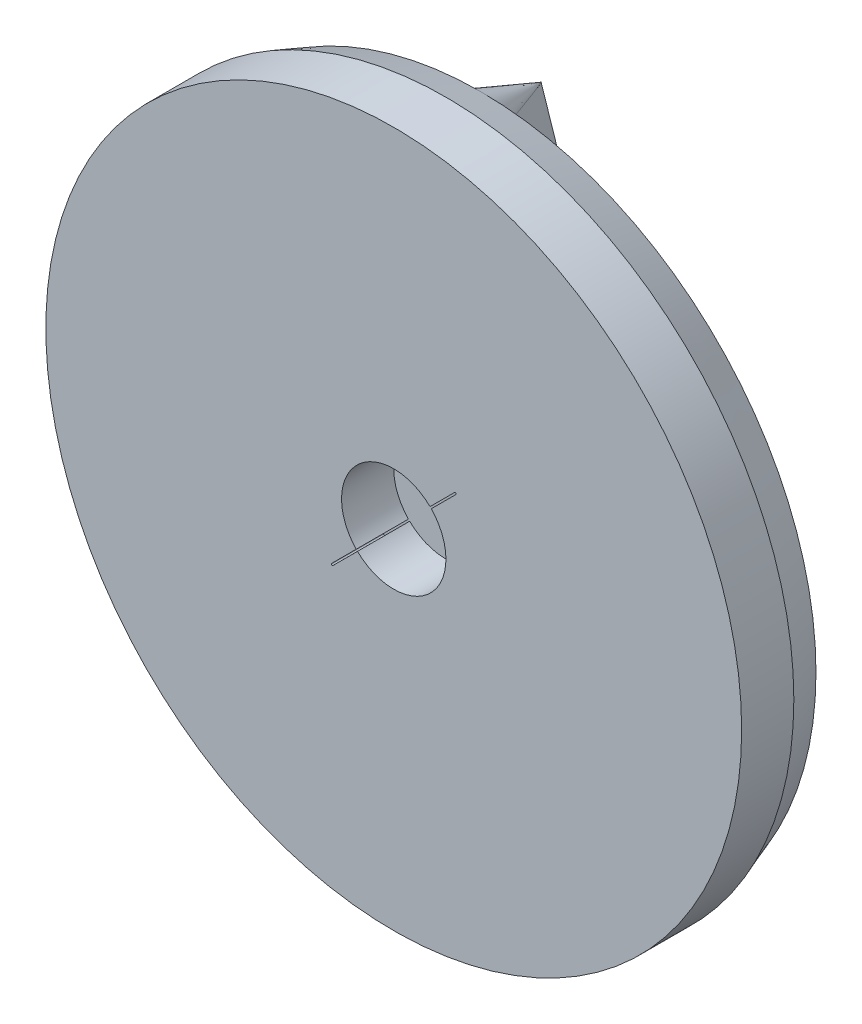
ISO-10303-21;
HEADER;
FILE_DESCRIPTION(('STEP AP214'),'2;1');
FILE_NAME('part.step','',(''),(''),'','','');
FILE_SCHEMA(('AUTOMOTIVE_DESIGN { 1 0 10303 214 1 1 1 1 }'));
ENDSEC;
DATA;
#1=APPLICATION_CONTEXT('core data for automotive mechanical design processes');
#2=APPLICATION_PROTOCOL_DEFINITION('international standard','automotive_design',2000,#1);
#3=PRODUCT_CONTEXT('',#1,'mechanical');
#4=PRODUCT('Part','Part','',(#3));
#5=PRODUCT_RELATED_PRODUCT_CATEGORY('part','',(#4));
#6=PRODUCT_DEFINITION_FORMATION('','',#4);
#7=PRODUCT_DEFINITION_CONTEXT('part definition',#1,'design');
#8=PRODUCT_DEFINITION('design','',#6,#7);
#9=PRODUCT_DEFINITION_SHAPE('','',#8);
#10=(LENGTH_UNIT() NAMED_UNIT(*) SI_UNIT(.MILLI.,.METRE.));
#11=(NAMED_UNIT(*) PLANE_ANGLE_UNIT() SI_UNIT($,.RADIAN.));
#12=(NAMED_UNIT(*) SI_UNIT($,.STERADIAN.) SOLID_ANGLE_UNIT());
#13=UNCERTAINTY_MEASURE_WITH_UNIT(LENGTH_MEASURE(1.E-05),#10,'distance_accuracy_value','');
#14=(GEOMETRIC_REPRESENTATION_CONTEXT(3) GLOBAL_UNCERTAINTY_ASSIGNED_CONTEXT((#13)) GLOBAL_UNIT_ASSIGNED_CONTEXT((#10,
#11,#12)) REPRESENTATION_CONTEXT('',''));
#15=CARTESIAN_POINT('',(0.,0.,0.));
#16=DIRECTION('',(0.,0.,1.));
#17=DIRECTION('',(1.,0.,0.));
#18=AXIS2_PLACEMENT_3D('',#15,#16,#17);
#19=CARTESIAN_POINT('',(0.,0.,-2.));
#20=DIRECTION('',(0.,0.,1.));
#21=DIRECTION('',(1.,0.,0.));
#22=AXIS2_PLACEMENT_3D('',#19,#20,#21);
#23=PLANE('',#22);
#24=CARTESIAN_POINT('',(0.,18.,-2.));
#25=DIRECTION('',(0.,0.,1.));
#26=DIRECTION('',(1.,0.,0.));
#27=AXIS2_PLACEMENT_3D('',#24,#25,#26);
#28=CIRCLE('',#27,1.2720595314676);
#29=CARTESIAN_POINT('',(0.,19.2720595314676,-2.));
#30=VERTEX_POINT('',#29);
#31=CARTESIAN_POINT('',(-1.27172190277635,17.9706937955885,-1.99999999997781));
#32=VERTEX_POINT('',#31);
#33=EDGE_CURVE('E303',#30,#32,#28,.T.);
#34=ORIENTED_EDGE('',*,*,#33,.T.);
#35=DIRECTION('',(-0.0905357460425185,-0.995893206467704,0.));
#36=VECTOR('',#35,1.);
#37=CARTESIAN_POINT('',(-2.88160640972484,0.261964219065894,-2.));
#38=LINE('',#37,#36);
#39=CARTESIAN_POINT('',(-4.27194173697115,-15.0317243806433,-1.99999999999996));
#40=VERTEX_POINT('',#39);
#41=EDGE_CURVE('E308',#32,#40,#38,.T.);
#42=ORIENTED_EDGE('',*,*,#41,.T.);
#43=CARTESIAN_POINT('',(0.,-15.,-2.));
#44=DIRECTION('',(0.,0.,1.));
#45=DIRECTION('',(1.,0.,0.));
#46=AXIS2_PLACEMENT_3D('',#43,#44,#45);
#47=CIRCLE('',#46,4.2720595314676);
#48=CARTESIAN_POINT('',(0.,-19.2720595314676,-2.));
#49=VERTEX_POINT('',#48);
#50=EDGE_CURVE('E315',#40,#49,#47,.T.);
#51=ORIENTED_EDGE('',*,*,#50,.T.);
#52=CARTESIAN_POINT('',(0.,0.,-2.));
#53=DIRECTION('',(0.,0.,1.));
#54=DIRECTION('',(1.,0.,0.));
#55=AXIS2_PLACEMENT_3D('',#52,#53,#54);
#56=CIRCLE('',#55,19.2720595314676);
#57=EDGE_CURVE('E11',#30,#49,#56,.T.);
#58=ORIENTED_EDGE('',*,*,#57,.F.);
#59=EDGE_LOOP('',(#34,#42,#51,#58));
#60=FACE_BOUND('',#59,.T.);
#61=ADVANCED_FACE('F41',(#60),#23,.F.);
#62=CARTESIAN_POINT('',(0.,0.,0.));
#63=DIRECTION('',(0.,0.,1.));
#64=DIRECTION('',(1.,0.,0.));
#65=AXIS2_PLACEMENT_3D('',#62,#63,#64);
#66=CONICAL_SURFACE('',#65,20.,0.349065850398867);
#67=CARTESIAN_POINT('',(0.,0.,0.));
#68=DIRECTION('',(0.,0.,1.));
#69=DIRECTION('',(1.,0.,0.));
#70=AXIS2_PLACEMENT_3D('',#67,#68,#69);
#71=CIRCLE('',#70,20.);
#72=CARTESIAN_POINT('',(20.,0.,0.));
#73=VERTEX_POINT('',#72);
#74=EDGE_CURVE('E316',#73,#73,#71,.T.);
#75=ORIENTED_EDGE('',*,*,#74,.F.);
#76=EDGE_LOOP('',(#75));
#77=FACE_BOUND('',#76,.T.);
#78=ORIENTED_EDGE('',*,*,#57,.T.);
#79=EDGE_CURVE('E50',#49,#30,#56,.T.);
#80=ORIENTED_EDGE('',*,*,#79,.T.);
#81=EDGE_LOOP('',(#78,#80));
#82=FACE_BOUND('',#81,.T.);
#83=ADVANCED_FACE('F43',(#77,#82),#66,.T.);
#84=ORIENTED_EDGE('',*,*,#79,.F.);
#85=CARTESIAN_POINT('',(4.27194173697115,-15.0317243806433,-1.99999999999996));
#86=VERTEX_POINT('',#85);
#87=EDGE_CURVE('E312',#49,#86,#47,.T.);
#88=ORIENTED_EDGE('',*,*,#87,.T.);
#89=DIRECTION('',(-0.0905357460425186,0.995893206467704,0.));
#90=VECTOR('',#89,1.);
#91=CARTESIAN_POINT('',(2.88160640972484,0.261964219065895,-2.));
#92=LINE('',#91,#90);
#93=CARTESIAN_POINT('',(1.27172190276827,17.9706937955882,-2.));
#94=VERTEX_POINT('',#93);
#95=EDGE_CURVE('E247',#86,#94,#92,.T.);
#96=ORIENTED_EDGE('',*,*,#95,.T.);
#97=EDGE_CURVE('E307',#94,#30,#28,.T.);
#98=ORIENTED_EDGE('',*,*,#97,.T.);
#99=EDGE_LOOP('',(#84,#88,#96,#98));
#100=FACE_BOUND('',#99,.T.);
#101=ADVANCED_FACE('F262',(#100),#23,.F.);
#102=CARTESIAN_POINT('',(0.,-15.,0.));
#103=DIRECTION('',(0.,0.,1.));
#104=DIRECTION('',(1.,0.,0.));
#105=AXIS2_PLACEMENT_3D('',#102,#103,#104);
#106=CONICAL_SURFACE('',#105,5.,0.349065850398867);
#107=ORIENTED_EDGE('',*,*,#50,.F.);
#108=CARTESIAN_POINT('',(-1.35557940364719,-15.1131998099234,-10.));
#109=CARTESIAN_POINT('',(-1.47152429195794,-15.1127493254877,-9.68264022531766));
#110=CARTESIAN_POINT('',(-1.58742127746624,-15.1117086108638,-9.36526470524089));
#111=CARTESIAN_POINT('',(-1.81913886773945,-15.1087008475732,-8.73049223674115));
#112=CARTESIAN_POINT('',(-1.93495947296489,-15.1067338045439,-8.41309528846034));
#113=CARTESIAN_POINT('',(-2.2968381613521,-15.0995359334336,-7.4211345236218));
#114=CARTESIAN_POINT('',(-2.542798579936,-15.0931231478979,-6.74654393039555));
#115=CARTESIAN_POINT('',(-3.03455885754886,-15.0783757588888,-5.39732402360426));
#116=CARTESIAN_POINT('',(-3.28035871608836,-15.0700411495836,-4.72269470992793));
#117=CARTESIAN_POINT('',(-3.77184967112229,-15.0520090879505,-3.3733946763651));
#118=CARTESIAN_POINT('',(-4.01754076456712,-15.0423115995711,-2.69872395585534));
#119=CARTESIAN_POINT('',(-4.50883183261875,-15.0218658897777,-1.34937046916008));
#120=CARTESIAN_POINT('',(-4.75443180784455,-15.0111176756379,-0.674687703090297));
#121=CARTESIAN_POINT('',(-5.00000000000206,-15.0000000000249,-5.68905754800977E-13));
#122=B_SPLINE_CURVE_WITH_KNOTS('',3,(#108,#109,#110,#111,#112,#113,#114,#115,#116,#117,#118,
#119,#120,#121),.UNSPECIFIED.,.F.,.F.,(4,2,2,2,2,2,4),(0.,1.01362824345405,2.02725031829099,
4.18142558107841,6.33560738066218,8.48984617418498,10.6440700548492),.UNSPECIFIED.);
#123=CARTESIAN_POINT('',(-1.35557940364719,-15.1131998099234,-10.));
#124=VERTEX_POINT('',#123);
#125=EDGE_CURVE('E237',#124,#40,#122,.T.);
#126=ORIENTED_EDGE('',*,*,#125,.F.);
#127=CARTESIAN_POINT('',(0.,-15.,-10.));
#128=DIRECTION('',(0.,0.,1.));
#129=DIRECTION('',(1.,0.,0.));
#130=AXIS2_PLACEMENT_3D('',#127,#128,#129);
#131=CIRCLE('',#130,1.36029765733797);
#132=CARTESIAN_POINT('',(1.35557940364719,-15.1131998099234,-10.));
#133=VERTEX_POINT('',#132);
#134=EDGE_CURVE('E151',#124,#133,#131,.T.);
#135=ORIENTED_EDGE('',*,*,#134,.T.);
#136=CARTESIAN_POINT('',(1.35557940364719,-15.1131998099234,-10.));
#137=CARTESIAN_POINT('',(1.47152429195794,-15.1127493254877,-9.68264022531766));
#138=CARTESIAN_POINT('',(1.58742127746625,-15.1117086108638,-9.36526470524089));
#139=CARTESIAN_POINT('',(1.81913886773946,-15.1087008475732,-8.73049223674115));
#140=CARTESIAN_POINT('',(1.93495947296489,-15.1067338045439,-8.41309528846034));
#141=CARTESIAN_POINT('',(2.29683816135211,-15.0995359334336,-7.4211345236218));
#142=CARTESIAN_POINT('',(2.542798579936,-15.0931231478979,-6.74654393039555));
#143=CARTESIAN_POINT('',(3.03455885754887,-15.0783757588888,-5.39732402360427));
#144=CARTESIAN_POINT('',(3.28035871608836,-15.0700411495836,-4.72269470992793));
#145=CARTESIAN_POINT('',(3.7718496711223,-15.0520090879505,-3.3733946763651));
#146=CARTESIAN_POINT('',(4.01754076456712,-15.0423115995711,-2.69872395585534));
#147=CARTESIAN_POINT('',(4.50883183261875,-15.0218658897777,-1.34937046916008));
#148=CARTESIAN_POINT('',(4.75443180784456,-15.0111176756379,-0.6746877030903));
#149=CARTESIAN_POINT('',(5.00000000000206,-15.0000000000249,-5.70215291144058E-13));
#150=B_SPLINE_CURVE_WITH_KNOTS('',3,(#136,#137,#138,#139,#140,#141,#142,#143,#144,#145,#146,
#147,#148,#149),.UNSPECIFIED.,.F.,.F.,(4,2,2,2,2,2,4),(0.,1.01362824345405,2.02725031829099,
4.18142558107841,6.33560738066218,8.48984617418498,10.6440700548492),.UNSPECIFIED.);
#151=EDGE_CURVE('E249',#133,#86,#150,.T.);
#152=ORIENTED_EDGE('',*,*,#151,.T.);
#153=ORIENTED_EDGE('',*,*,#87,.F.);
#154=EDGE_LOOP('',(#107,#126,#135,#152,#153));
#155=FACE_BOUND('',#154,.T.);
#156=ADVANCED_FACE('F259',(#155),#106,.T.);
#157=CARTESIAN_POINT('',(-5.,-15.,0.));
#158=DIRECTION('',(-0.935833497208518,0.0850757724735016,-0.342020143325669));
#159=DIRECTION('',(-0.343264654725118,0.,0.939238721953288));
#160=AXIS2_PLACEMENT_3D('',#157,#158,#159);
#161=PLANE('',#160);
#162=ORIENTED_EDGE('',*,*,#41,.F.);
#163=CARTESIAN_POINT('',(0.,17.9924683009297,-5.47426166578347));
#164=CARTESIAN_POINT('',(-0.000658792508696172,17.9918721301336,-5.4726073760658));
#165=CARTESIAN_POINT('',(-0.00131899163214776,17.9913406864215,-5.47093313704391));
#166=CARTESIAN_POINT('',(-0.00263962265345564,17.990369181912,-5.46756129104861));
#167=CARTESIAN_POINT('',(-0.00330005258229472,17.9899289798807,-5.46586372459401));
#168=CARTESIAN_POINT('',(-0.00660119120331832,17.9878573956222,-5.45734646464226));
#169=CARTESIAN_POINT('',(-0.00923977768205241,17.9866136247982,-5.45043616156633));
#170=CARTESIAN_POINT('',(-0.0145127936017149,17.9844201137202,-5.4365537912668));
#171=CARTESIAN_POINT('',(-0.0171471898100953,17.9834712208195,-5.42958160419907));
#172=CARTESIAN_POINT('',(-0.0250221998469685,17.9808932100017,-5.40867531531193));
#173=CARTESIAN_POINT('',(-0.0302525776186212,17.9795245433101,-5.3947044354121));
#174=CARTESIAN_POINT('',(-0.0406972144000417,17.9770995793523,-5.36672907936651));
#175=CARTESIAN_POINT('',(-0.0459114679466594,17.9760433784645,-5.35272459419534));
#176=CARTESIAN_POINT('',(-0.0615432767863536,17.9731694920844,-5.31066779575507));
#177=CARTESIAN_POINT('',(-0.0719437063987493,17.9716481186552,-5.28258863555256));
#178=CARTESIAN_POINT('',(-0.103079585425852,17.9676533722367,-5.1983885000249));
#179=CARTESIAN_POINT('',(-0.123777495013433,17.9657438016001,-5.14222999798324));
#180=CARTESIAN_POINT('',(-0.165116283694516,17.9626022427273,-5.02990049522257));
#181=CARTESIAN_POINT('',(-0.185757182022399,17.9613699881948,-4.97372950811442));
#182=CARTESIAN_POINT('',(-0.247666378160753,17.958286597704,-4.80510090880773));
#183=CARTESIAN_POINT('',(-0.288888753669274,17.9570517306312,-4.69261565518737));
#184=CARTESIAN_POINT('',(-0.412431132476277,17.9545078686936,-4.35521250030029));
#185=CARTESIAN_POINT('',(-0.49466013336963,17.954357657174,-4.13025535780924));
#186=CARTESIAN_POINT('',(-0.659003830598069,17.9554293534376,-3.68031252458136));
#187=CARTESIAN_POINT('',(-0.741118530067599,17.9566512228219,-3.45532683481965));
#188=CARTESIAN_POINT('',(-0.987318725156767,17.9615534475133,-2.78045591086828));
#189=CARTESIAN_POINT('',(-1.15130204729044,17.9664704115592,-2.33054264302856));
#190=CARTESIAN_POINT('',(-1.42939349733308,17.9761667756041,-1.56721853772901));
#191=CARTESIAN_POINT('',(-1.5435365156784,17.9805351651275,-1.25381447003018));
#192=CARTESIAN_POINT('',(-1.77179223247623,17.989866742006,-0.626941342806422));
#193=CARTESIAN_POINT('',(-1.88590492200445,17.9948300343497,-0.313472281584696));
#194=CARTESIAN_POINT('',(-2.,18.,0.));
#195=B_SPLINE_CURVE_WITH_KNOTS('',3,(#163,#164,#165,#166,#167,#168,#169,#170,#171,#172,#173,
#174,#175,#176,#177,#178,#179,#180,#181,#182,#183,#184,#185,#186,#187,#188,#189,#190,#191,#192,
#193,#194),.UNSPECIFIED.,.F.,.F.,(4,2,2,2,2,2,2,2,2,2,2,2,2,2,2,4),(0.,0.00562865848783333,
0.0112485381626291,0.0337254741632951,0.056266414466628,0.101195369903801,0.146138169027114,
0.236076807309796,0.415713944813965,0.595280404839262,0.954694769083883,1.67322992369596,
2.39174496990232,3.82841037446911,4.82912426406011,5.83001502069884),.UNSPECIFIED.);
#196=CARTESIAN_POINT('',(0.,17.9924683009297,-5.47426166578347));
#197=VERTEX_POINT('',#196);
#198=EDGE_CURVE('E248',#197,#32,#195,.T.);
#199=ORIENTED_EDGE('',*,*,#198,.F.);
#200=DIRECTION('',(0.,0.970428403441208,0.241389133546952));
#201=VECTOR('',#200,1.);
#202=CARTESIAN_POINT('',(0.,19.2819117034801,-5.15351917247256));
#203=LINE('',#202,#201);
#204=CARTESIAN_POINT('',(0.,-0.201826369804339,-10.));
#205=VERTEX_POINT('',#204);
#206=EDGE_CURVE('E281',#205,#197,#203,.T.);
#207=ORIENTED_EDGE('',*,*,#206,.F.);
#208=DIRECTION('',(-0.0905357460425185,-0.995893206467704,0.));
#209=VECTOR('',#208,1.);
#210=CARTESIAN_POINT('',(-1.33426155682092,-14.8787034948345,-10.));
#211=LINE('',#210,#209);
#212=EDGE_CURVE('E293',#205,#124,#211,.T.);
#213=ORIENTED_EDGE('',*,*,#212,.T.);
#214=ORIENTED_EDGE('',*,*,#125,.T.);
#215=EDGE_LOOP('',(#162,#199,#207,#213,#214));
#216=FACE_BOUND('',#215,.T.);
#217=ADVANCED_FACE('F256',(#216),#161,.T.);
#218=CARTESIAN_POINT('',(0.,18.,0.));
#219=DIRECTION('',(0.,0.,1.));
#220=DIRECTION('',(1.,0.,0.));
#221=AXIS2_PLACEMENT_3D('',#218,#219,#220);
#222=CONICAL_SURFACE('',#221,2.,0.349065850398867);
#223=CARTESIAN_POINT('',(0.,18.,-5.49495483890924));
#224=VERTEX_POINT('',#223);
#225=VERTEX_LOOP('',#224);
#226=FACE_BOUND('',#225,.T.);
#227=ORIENTED_EDGE('',*,*,#97,.F.);
#228=CARTESIAN_POINT('',(0.,17.9924683009297,-5.47426166578347));
#229=CARTESIAN_POINT('',(0.000658792508696435,17.9918721301336,-5.4726073760658));
#230=CARTESIAN_POINT('',(0.00131899163214815,17.9913406864215,-5.47093313704391));
#231=CARTESIAN_POINT('',(0.00263962265345574,17.990369181912,-5.46756129104861));
#232=CARTESIAN_POINT('',(0.0033000525822944,17.9899289798807,-5.46586372459401));
#233=CARTESIAN_POINT('',(0.00660119120331671,17.9878573956222,-5.45734646464226));
#234=CARTESIAN_POINT('',(0.00923977768205238,17.9866136247982,-5.45043616156633));
#235=CARTESIAN_POINT('',(0.0145127936017156,17.9844201137202,-5.4365537912668));
#236=CARTESIAN_POINT('',(0.0171471898100951,17.9834712208195,-5.42958160419907));
#237=CARTESIAN_POINT('',(0.0250221998469676,17.9808932100017,-5.40867531531193));
#238=CARTESIAN_POINT('',(0.0302525776186212,17.9795245433101,-5.3947044354121));
#239=CARTESIAN_POINT('',(0.0406972144000423,17.9770995793523,-5.36672907936651));
#240=CARTESIAN_POINT('',(0.0459114679466596,17.9760433784645,-5.35272459419534));
#241=CARTESIAN_POINT('',(0.0615432767863528,17.9731694920844,-5.31066779575507));
#242=CARTESIAN_POINT('',(0.0719437063987487,17.9716481186552,-5.28258863555256));
#243=CARTESIAN_POINT('',(0.103079585425852,17.9676533722367,-5.19838850002491));
#244=CARTESIAN_POINT('',(0.123777495013432,17.9657438016001,-5.14222999798324));
#245=CARTESIAN_POINT('',(0.165116283694515,17.9626022427273,-5.02990049522257));
#246=CARTESIAN_POINT('',(0.185757182022398,17.9613699881948,-4.97372950811442));
#247=CARTESIAN_POINT('',(0.247666378160752,17.958286597704,-4.80510090880773));
#248=CARTESIAN_POINT('',(0.288888753669273,17.9570517306312,-4.69261565518737));
#249=CARTESIAN_POINT('',(0.412431132476277,17.9545078686936,-4.35521250030029));
#250=CARTESIAN_POINT('',(0.49466013336963,17.954357657174,-4.13025535780924));
#251=CARTESIAN_POINT('',(0.659003830598069,17.9554293534376,-3.68031252458137));
#252=CARTESIAN_POINT('',(0.741118530067599,17.9566512228219,-3.45532683481965));
#253=CARTESIAN_POINT('',(0.987318725156767,17.9615534475133,-2.78045591086828));
#254=CARTESIAN_POINT('',(1.15130204729044,17.9664704115592,-2.33054264302856));
#255=CARTESIAN_POINT('',(1.42939349733308,17.9761667756041,-1.56721853772901));
#256=CARTESIAN_POINT('',(1.54353651567839,17.9805351651275,-1.25381447003018));
#257=CARTESIAN_POINT('',(1.77179223247623,17.989866742006,-0.626941342806422));
#258=CARTESIAN_POINT('',(1.88590492200445,17.9948300343497,-0.313472281584695));
#259=CARTESIAN_POINT('',(2.,18.,0.));
#260=B_SPLINE_CURVE_WITH_KNOTS('',3,(#228,#229,#230,#231,#232,#233,#234,#235,#236,#237,#238,
#239,#240,#241,#242,#243,#244,#245,#246,#247,#248,#249,#250,#251,#252,#253,#254,#255,#256,#257,
#258,#259),.UNSPECIFIED.,.F.,.F.,(4,2,2,2,2,2,2,2,2,2,2,2,2,2,2,4),(0.,0.00562865848783287,
0.0112485381626292,0.0337254741632972,0.0562664144666271,0.101195369903802,0.146138169027116,
0.236076807309795,0.415713944813962,0.595280404839262,0.954694769083882,1.67322992369596,
2.39174496990231,3.82841037446911,4.82912426406011,5.83001502069884),.UNSPECIFIED.);
#261=EDGE_CURVE('E65',#197,#94,#260,.T.);
#262=ORIENTED_EDGE('',*,*,#261,.F.);
#263=ORIENTED_EDGE('',*,*,#198,.T.);
#264=ORIENTED_EDGE('',*,*,#33,.F.);
#265=EDGE_LOOP('',(#227,#262,#263,#264));
#266=FACE_BOUND('',#265,.T.);
#267=ADVANCED_FACE('F270',(#226,#266),#222,.T.);
#268=CARTESIAN_POINT('',(2.,18.,0.));
#269=DIRECTION('',(0.935833497208518,0.0850757724735017,-0.342020143325669));
#270=DIRECTION('',(-0.343264654725118,0.,-0.939238721953288));
#271=AXIS2_PLACEMENT_3D('',#268,#269,#270);
#272=PLANE('',#271);
#273=ORIENTED_EDGE('',*,*,#95,.F.);
#274=ORIENTED_EDGE('',*,*,#151,.F.);
#275=DIRECTION('',(-0.0905357460425186,0.995893206467704,0.));
#276=VECTOR('',#275,1.);
#277=CARTESIAN_POINT('',(1.33426155682092,-14.8787034948345,-10.));
#278=LINE('',#277,#276);
#279=EDGE_CURVE('E292',#133,#205,#278,.T.);
#280=ORIENTED_EDGE('',*,*,#279,.T.);
#281=ORIENTED_EDGE('',*,*,#206,.T.);
#282=ORIENTED_EDGE('',*,*,#261,.T.);
#283=EDGE_LOOP('',(#273,#274,#280,#281,#282));
#284=FACE_BOUND('',#283,.T.);
#285=ADVANCED_FACE('F264',(#284),#272,.T.);
#286=CARTESIAN_POINT('',(0.,-15.,-10.));
#287=DIRECTION('',(0.,0.,1.));
#288=DIRECTION('',(1.,0.,0.));
#289=AXIS2_PLACEMENT_3D('',#286,#287,#288);
#290=PLANE('',#289);
#291=ORIENTED_EDGE('',*,*,#134,.F.);
#292=ORIENTED_EDGE('',*,*,#212,.F.);
#293=ORIENTED_EDGE('',*,*,#279,.F.);
#294=EDGE_LOOP('',(#291,#292,#293));
#295=FACE_BOUND('',#294,.T.);
#296=ADVANCED_FACE('F269',(#295),#290,.F.);
#297=CARTESIAN_POINT('',(-3.53553390593274,-3.53553390593274,3.));
#298=DIRECTION('',(0.,0.,-1.));
#299=DIRECTION('',(-1.,0.,0.));
#300=AXIS2_PLACEMENT_3D('',#297,#298,#299);
#301=CYLINDRICAL_SURFACE('',#300,0.0500000000000002);
#302=CARTESIAN_POINT('',(-3.53553390593274,-3.53553390593274,0.));
#303=DIRECTION('',(0.,0.,1.));
#304=DIRECTION('',(1.,0.,0.));
#305=AXIS2_PLACEMENT_3D('',#302,#303,#304);
#306=CIRCLE('',#305,0.0500000000000002);
#307=CARTESIAN_POINT('',(-3.57088924499207,-3.50017856687341,0.));
#308=VERTEX_POINT('',#307);
#309=CARTESIAN_POINT('',(-3.50017856687341,-3.57088924499207,0.));
#310=VERTEX_POINT('',#309);
#311=EDGE_CURVE('E145',#308,#310,#306,.T.);
#312=ORIENTED_EDGE('',*,*,#311,.F.);
#313=DIRECTION('',(0.,0.,-1.));
#314=VECTOR('',#313,1.);
#315=CARTESIAN_POINT('',(-3.57088924499207,-3.50017856687341,3.));
#316=LINE('',#315,#314);
#317=CARTESIAN_POINT('',(-3.57088924499207,-3.50017856687341,3.));
#318=VERTEX_POINT('',#317);
#319=EDGE_CURVE('E140',#318,#308,#316,.T.);
#320=ORIENTED_EDGE('',*,*,#319,.F.);
#321=CARTESIAN_POINT('',(-3.53553390593274,-3.53553390593274,3.));
#322=DIRECTION('',(0.,0.,1.));
#323=DIRECTION('',(1.,0.,0.));
#324=AXIS2_PLACEMENT_3D('',#321,#322,#323);
#325=CIRCLE('',#324,0.0500000000000002);
#326=CARTESIAN_POINT('',(-3.50017856687341,-3.57088924499207,3.));
#327=VERTEX_POINT('',#326);
#328=EDGE_CURVE('E143',#318,#327,#325,.T.);
#329=ORIENTED_EDGE('',*,*,#328,.T.);
#330=DIRECTION('',(0.,0.,-1.));
#331=VECTOR('',#330,1.);
#332=CARTESIAN_POINT('',(-3.50017856687341,-3.57088924499207,3.));
#333=LINE('',#332,#331);
#334=EDGE_CURVE('E193',#327,#310,#333,.T.);
#335=ORIENTED_EDGE('',*,*,#334,.T.);
#336=EDGE_LOOP('',(#312,#320,#329,#335));
#337=FACE_BOUND('',#336,.T.);
#338=ADVANCED_FACE('F142',(#337),#301,.F.);
#339=CARTESIAN_POINT('',(-0.0353553390593274,0.0353553390593274,3.));
#340=DIRECTION('',(0.707106781186547,-0.707106781186547,0.));
#341=DIRECTION('',(0.707106781186548,0.707106781186548,0.));
#342=AXIS2_PLACEMENT_3D('',#339,#340,#341);
#343=PLANE('',#342);
#344=DIRECTION('',(-0.707106781186548,-0.707106781186548,0.));
#345=VECTOR('',#344,1.);
#346=CARTESIAN_POINT('',(-0.0353553390593274,0.0353553390593274,0.));
#347=LINE('',#346,#345);
#348=CARTESIAN_POINT('',(-2.15638103433037,-2.08567035621171,0.));
#349=VERTEX_POINT('',#348);
#350=EDGE_CURVE('E196',#349,#308,#347,.T.);
#351=ORIENTED_EDGE('',*,*,#350,.F.);
#352=DIRECTION('',(0.,0.,-1.));
#353=VECTOR('',#352,1.);
#354=CARTESIAN_POINT('',(-2.15638103433037,-2.08567035621171,3.));
#355=LINE('',#354,#353);
#356=CARTESIAN_POINT('',(-2.15638103433037,-2.08567035621171,3.));
#357=VERTEX_POINT('',#356);
#358=EDGE_CURVE('E152',#357,#349,#355,.T.);
#359=ORIENTED_EDGE('',*,*,#358,.F.);
#360=DIRECTION('',(-0.707106781186548,-0.707106781186548,0.));
#361=VECTOR('',#360,1.);
#362=CARTESIAN_POINT('',(-0.0353553390593274,0.0353553390593274,3.));
#363=LINE('',#362,#361);
#364=EDGE_CURVE('E159',#357,#318,#363,.T.);
#365=ORIENTED_EDGE('',*,*,#364,.T.);
#366=ORIENTED_EDGE('',*,*,#319,.T.);
#367=EDGE_LOOP('',(#351,#359,#365,#366));
#368=FACE_BOUND('',#367,.T.);
#369=ADVANCED_FACE('F168',(#368),#343,.T.);
#370=CARTESIAN_POINT('',(0.,0.,3.));
#371=DIRECTION('',(0.,0.,-1.));
#372=DIRECTION('',(-1.,0.,0.));
#373=AXIS2_PLACEMENT_3D('',#370,#371,#372);
#374=CYLINDRICAL_SURFACE('',#373,3.);
#375=CARTESIAN_POINT('',(0.,0.,0.));
#376=DIRECTION('',(0.,0.,1.));
#377=DIRECTION('',(1.,0.,0.));
#378=AXIS2_PLACEMENT_3D('',#375,#376,#377);
#379=CIRCLE('',#378,3.);
#380=CARTESIAN_POINT('',(2.08567035621171,2.15638103433037,0.));
#381=VERTEX_POINT('',#380);
#382=EDGE_CURVE('E199',#381,#349,#379,.T.);
#383=ORIENTED_EDGE('',*,*,#382,.F.);
#384=DIRECTION('',(0.,0.,-1.));
#385=VECTOR('',#384,1.);
#386=CARTESIAN_POINT('',(2.08567035621171,2.15638103433037,3.));
#387=LINE('',#386,#385);
#388=CARTESIAN_POINT('',(2.08567035621171,2.15638103433037,3.));
#389=VERTEX_POINT('',#388);
#390=EDGE_CURVE('E232',#389,#381,#387,.T.);
#391=ORIENTED_EDGE('',*,*,#390,.F.);
#392=CARTESIAN_POINT('',(0.,0.,3.));
#393=DIRECTION('',(0.,0.,1.));
#394=DIRECTION('',(1.,0.,0.));
#395=AXIS2_PLACEMENT_3D('',#392,#393,#394);
#396=CIRCLE('',#395,3.);
#397=EDGE_CURVE('E170',#389,#357,#396,.T.);
#398=ORIENTED_EDGE('',*,*,#397,.T.);
#399=ORIENTED_EDGE('',*,*,#358,.T.);
#400=EDGE_LOOP('',(#383,#391,#398,#399));
#401=FACE_BOUND('',#400,.T.);
#402=ADVANCED_FACE('F352',(#401),#374,.F.);
#403=CARTESIAN_POINT('',(-0.0353553390593274,0.0353553390593274,3.));
#404=DIRECTION('',(-0.707106781186547,0.707106781186547,0.));
#405=DIRECTION('',(-0.707106781186548,-0.707106781186548,0.));
#406=AXIS2_PLACEMENT_3D('',#403,#404,#405);
#407=PLANE('',#406);
#408=DIRECTION('',(0.707106781186548,0.707106781186548,0.));
#409=VECTOR('',#408,1.);
#410=CARTESIAN_POINT('',(-0.0353553390593274,0.0353553390593274,0.));
#411=LINE('',#410,#409);
#412=CARTESIAN_POINT('',(3.50017856687341,3.57088924499207,0.));
#413=VERTEX_POINT('',#412);
#414=EDGE_CURVE('E203',#381,#413,#411,.T.);
#415=ORIENTED_EDGE('',*,*,#414,.T.);
#416=DIRECTION('',(0.,0.,-1.));
#417=VECTOR('',#416,1.);
#418=CARTESIAN_POINT('',(3.50017856687341,3.57088924499207,3.));
#419=LINE('',#418,#417);
#420=CARTESIAN_POINT('',(3.50017856687341,3.57088924499207,3.));
#421=VERTEX_POINT('',#420);
#422=EDGE_CURVE('E229',#421,#413,#419,.T.);
#423=ORIENTED_EDGE('',*,*,#422,.F.);
#424=DIRECTION('',(0.707106781186548,0.707106781186548,0.));
#425=VECTOR('',#424,1.);
#426=CARTESIAN_POINT('',(-0.0353553390593274,0.0353553390593274,3.));
#427=LINE('',#426,#425);
#428=EDGE_CURVE('E173',#389,#421,#427,.T.);
#429=ORIENTED_EDGE('',*,*,#428,.F.);
#430=ORIENTED_EDGE('',*,*,#390,.T.);
#431=EDGE_LOOP('',(#415,#423,#429,#430));
#432=FACE_BOUND('',#431,.T.);
#433=ADVANCED_FACE('F358',(#432),#407,.F.);
#434=CARTESIAN_POINT('',(3.53553390593273,3.53553390593274,3.));
#435=DIRECTION('',(0.,0.,-1.));
#436=DIRECTION('',(-1.,0.,0.));
#437=AXIS2_PLACEMENT_3D('',#434,#435,#436);
#438=CYLINDRICAL_SURFACE('',#437,0.0500000000000097);
#439=CARTESIAN_POINT('',(3.53553390593273,3.53553390593274,0.));
#440=DIRECTION('',(0.,0.,1.));
#441=DIRECTION('',(1.,0.,0.));
#442=AXIS2_PLACEMENT_3D('',#439,#440,#441);
#443=CIRCLE('',#442,0.0500000000000097);
#444=CARTESIAN_POINT('',(3.57088924499207,3.50017856687341,0.));
#445=VERTEX_POINT('',#444);
#446=EDGE_CURVE('E207',#445,#413,#443,.T.);
#447=ORIENTED_EDGE('',*,*,#446,.F.);
#448=DIRECTION('',(0.,0.,-1.));
#449=VECTOR('',#448,1.);
#450=CARTESIAN_POINT('',(3.57088924499207,3.50017856687341,3.));
#451=LINE('',#450,#449);
#452=CARTESIAN_POINT('',(3.57088924499207,3.50017856687341,3.));
#453=VERTEX_POINT('',#452);
#454=EDGE_CURVE('E226',#453,#445,#451,.T.);
#455=ORIENTED_EDGE('',*,*,#454,.F.);
#456=CARTESIAN_POINT('',(3.53553390593273,3.53553390593274,3.));
#457=DIRECTION('',(0.,0.,1.));
#458=DIRECTION('',(1.,0.,0.));
#459=AXIS2_PLACEMENT_3D('',#456,#457,#458);
#460=CIRCLE('',#459,0.0500000000000097);
#461=EDGE_CURVE('E179',#453,#421,#460,.T.);
#462=ORIENTED_EDGE('',*,*,#461,.T.);
#463=ORIENTED_EDGE('',*,*,#422,.T.);
#464=EDGE_LOOP('',(#447,#455,#462,#463));
#465=FACE_BOUND('',#464,.T.);
#466=ADVANCED_FACE('F361',(#465),#438,.F.);
#467=CARTESIAN_POINT('',(0.0353553390593274,-0.0353553390593274,3.));
#468=DIRECTION('',(-0.707106781186547,0.707106781186547,0.));
#469=DIRECTION('',(-0.707106781186548,-0.707106781186548,0.));
#470=AXIS2_PLACEMENT_3D('',#467,#468,#469);
#471=PLANE('',#470);
#472=DIRECTION('',(0.707106781186548,0.707106781186548,0.));
#473=VECTOR('',#472,1.);
#474=CARTESIAN_POINT('',(0.0353553390593274,-0.0353553390593274,0.));
#475=LINE('',#474,#473);
#476=CARTESIAN_POINT('',(2.15638103433037,2.08567035621171,0.));
#477=VERTEX_POINT('',#476);
#478=EDGE_CURVE('E211',#477,#445,#475,.T.);
#479=ORIENTED_EDGE('',*,*,#478,.F.);
#480=DIRECTION('',(0.,0.,-1.));
#481=VECTOR('',#480,1.);
#482=CARTESIAN_POINT('',(2.15638103433037,2.08567035621171,3.));
#483=LINE('',#482,#481);
#484=CARTESIAN_POINT('',(2.15638103433037,2.08567035621171,3.));
#485=VERTEX_POINT('',#484);
#486=EDGE_CURVE('E223',#485,#477,#483,.T.);
#487=ORIENTED_EDGE('',*,*,#486,.F.);
#488=DIRECTION('',(0.707106781186548,0.707106781186548,0.));
#489=VECTOR('',#488,1.);
#490=CARTESIAN_POINT('',(0.0353553390593274,-0.0353553390593274,3.));
#491=LINE('',#490,#489);
#492=EDGE_CURVE('E183',#485,#453,#491,.T.);
#493=ORIENTED_EDGE('',*,*,#492,.T.);
#494=ORIENTED_EDGE('',*,*,#454,.T.);
#495=EDGE_LOOP('',(#479,#487,#493,#494));
#496=FACE_BOUND('',#495,.T.);
#497=ADVANCED_FACE('F364',(#496),#471,.T.);
#498=CARTESIAN_POINT('',(-2.08567035621171,-2.15638103433037,0.));
#499=VERTEX_POINT('',#498);
#500=EDGE_CURVE('E57',#499,#477,#379,.T.);
#501=ORIENTED_EDGE('',*,*,#500,.F.);
#502=DIRECTION('',(0.,0.,-1.));
#503=VECTOR('',#502,1.);
#504=CARTESIAN_POINT('',(-2.08567035621171,-2.15638103433037,3.));
#505=LINE('',#504,#503);
#506=CARTESIAN_POINT('',(-2.08567035621171,-2.15638103433037,3.));
#507=VERTEX_POINT('',#506);
#508=EDGE_CURVE('E220',#507,#499,#505,.T.);
#509=ORIENTED_EDGE('',*,*,#508,.F.);
#510=EDGE_CURVE('E175',#507,#485,#396,.T.);
#511=ORIENTED_EDGE('',*,*,#510,.T.);
#512=ORIENTED_EDGE('',*,*,#486,.T.);
#513=EDGE_LOOP('',(#501,#509,#511,#512));
#514=FACE_BOUND('',#513,.T.);
#515=ADVANCED_FACE('F366',(#514),#374,.F.);
#516=CARTESIAN_POINT('',(0.0353553390593274,-0.0353553390593274,3.));
#517=DIRECTION('',(0.707106781186547,-0.707106781186547,0.));
#518=DIRECTION('',(0.707106781186548,0.707106781186548,0.));
#519=AXIS2_PLACEMENT_3D('',#516,#517,#518);
#520=PLANE('',#519);
#521=DIRECTION('',(-0.707106781186548,-0.707106781186548,0.));
#522=VECTOR('',#521,1.);
#523=CARTESIAN_POINT('',(0.0353553390593274,-0.0353553390593274,0.));
#524=LINE('',#523,#522);
#525=EDGE_CURVE('E166',#499,#310,#524,.T.);
#526=ORIENTED_EDGE('',*,*,#525,.T.);
#527=ORIENTED_EDGE('',*,*,#334,.F.);
#528=DIRECTION('',(-0.707106781186548,-0.707106781186548,0.));
#529=VECTOR('',#528,1.);
#530=CARTESIAN_POINT('',(0.0353553390593274,-0.0353553390593274,3.));
#531=LINE('',#530,#529);
#532=EDGE_CURVE('E163',#507,#327,#531,.T.);
#533=ORIENTED_EDGE('',*,*,#532,.F.);
#534=ORIENTED_EDGE('',*,*,#508,.T.);
#535=EDGE_LOOP('',(#526,#527,#533,#534));
#536=FACE_BOUND('',#535,.T.);
#537=ADVANCED_FACE('F395',(#536),#520,.F.);
#538=CARTESIAN_POINT('',(0.,0.,3.));
#539=DIRECTION('',(0.,0.,-1.));
#540=DIRECTION('',(-1.,0.,0.));
#541=AXIS2_PLACEMENT_3D('',#538,#539,#540);
#542=CYLINDRICAL_SURFACE('',#541,20.);
#543=CARTESIAN_POINT('',(0.,0.,3.));
#544=DIRECTION('',(0.,0.,1.));
#545=DIRECTION('',(1.,0.,0.));
#546=AXIS2_PLACEMENT_3D('',#543,#544,#545);
#547=CIRCLE('',#546,20.);
#548=CARTESIAN_POINT('',(20.,0.,3.));
#549=VERTEX_POINT('',#548);
#550=EDGE_CURVE('E189',#549,#549,#547,.T.);
#551=ORIENTED_EDGE('',*,*,#550,.F.);
#552=EDGE_LOOP('',(#551));
#553=FACE_BOUND('',#552,.T.);
#554=ORIENTED_EDGE('',*,*,#74,.T.);
#555=EDGE_LOOP('',(#554));
#556=FACE_BOUND('',#555,.T.);
#557=ADVANCED_FACE('F346',(#553,#556),#542,.T.);
#558=CARTESIAN_POINT('',(0.,0.,3.));
#559=DIRECTION('',(0.,0.,1.));
#560=DIRECTION('',(1.,0.,0.));
#561=AXIS2_PLACEMENT_3D('',#558,#559,#560);
#562=PLANE('',#561);
#563=ORIENTED_EDGE('',*,*,#328,.F.);
#564=ORIENTED_EDGE('',*,*,#364,.F.);
#565=ORIENTED_EDGE('',*,*,#397,.F.);
#566=ORIENTED_EDGE('',*,*,#428,.T.);
#567=ORIENTED_EDGE('',*,*,#461,.F.);
#568=ORIENTED_EDGE('',*,*,#492,.F.);
#569=ORIENTED_EDGE('',*,*,#510,.F.);
#570=ORIENTED_EDGE('',*,*,#532,.T.);
#571=EDGE_LOOP('',(#563,#564,#565,#566,#567,#568,#569,#570));
#572=FACE_BOUND('',#571,.T.);
#573=ORIENTED_EDGE('',*,*,#550,.T.);
#574=EDGE_LOOP('',(#573));
#575=FACE_BOUND('',#574,.T.);
#576=ADVANCED_FACE('F156',(#572,#575),#562,.T.);
#577=CARTESIAN_POINT('',(0.,0.,0.));
#578=DIRECTION('',(0.,0.,1.));
#579=DIRECTION('',(1.,0.,0.));
#580=AXIS2_PLACEMENT_3D('',#577,#578,#579);
#581=PLANE('',#580);
#582=ORIENTED_EDGE('',*,*,#311,.T.);
#583=ORIENTED_EDGE('',*,*,#525,.F.);
#584=ORIENTED_EDGE('',*,*,#500,.T.);
#585=ORIENTED_EDGE('',*,*,#478,.T.);
#586=ORIENTED_EDGE('',*,*,#446,.T.);
#587=ORIENTED_EDGE('',*,*,#414,.F.);
#588=ORIENTED_EDGE('',*,*,#382,.T.);
#589=ORIENTED_EDGE('',*,*,#350,.T.);
#590=EDGE_LOOP('',(#582,#583,#584,#585,#586,#587,#588,#589));
#591=FACE_BOUND('',#590,.T.);
#592=ADVANCED_FACE('F339',(#591),#581,.T.);
#593=CLOSED_SHELL('',(#61,#83,#101,#156,#217,#267,#285,#296,#338,#369,#402,#433,#466,#497,#515,
#537,#557,#576,#592));
#594=MANIFOLD_SOLID_BREP('B2',#593);
#595=ADVANCED_BREP_SHAPE_REPRESENTATION('',(#18,#594),#14);
#596=SHAPE_DEFINITION_REPRESENTATION(#9,#595);
ENDSEC;
END-ISO-10303-21;
